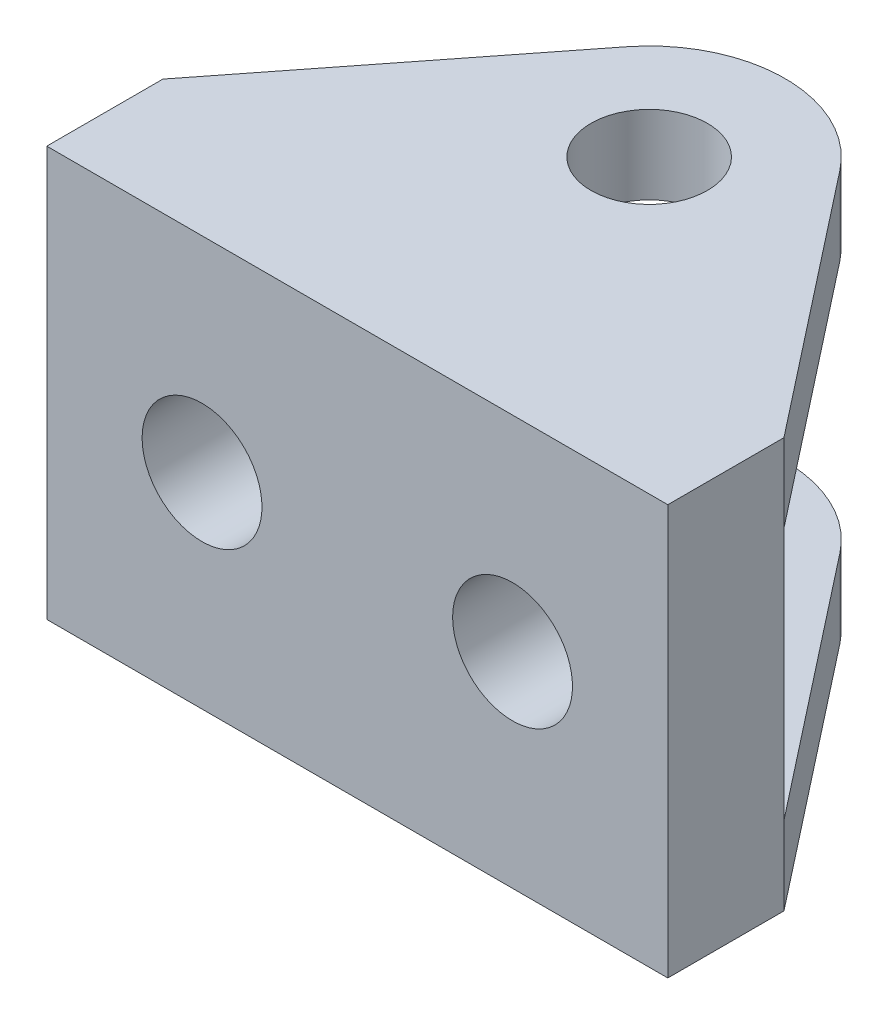
ISO-10303-21;
HEADER;
FILE_DESCRIPTION(('STEP AP214'),'2;1');
FILE_NAME('part.step','',(''),(''),'','','');
FILE_SCHEMA(('AUTOMOTIVE_DESIGN { 1 0 10303 214 1 1 1 1 }'));
ENDSEC;
DATA;
#1=APPLICATION_CONTEXT('core data for automotive mechanical design processes');
#2=APPLICATION_PROTOCOL_DEFINITION('international standard','automotive_design',2000,#1);
#3=PRODUCT_CONTEXT('',#1,'mechanical');
#4=PRODUCT('Part','Part','',(#3));
#5=PRODUCT_RELATED_PRODUCT_CATEGORY('part','',(#4));
#6=PRODUCT_DEFINITION_FORMATION('','',#4);
#7=PRODUCT_DEFINITION_CONTEXT('part definition',#1,'design');
#8=PRODUCT_DEFINITION('design','',#6,#7);
#9=PRODUCT_DEFINITION_SHAPE('','',#8);
#10=(LENGTH_UNIT() NAMED_UNIT(*) SI_UNIT(.MILLI.,.METRE.));
#11=(NAMED_UNIT(*) PLANE_ANGLE_UNIT() SI_UNIT($,.RADIAN.));
#12=(NAMED_UNIT(*) SI_UNIT($,.STERADIAN.) SOLID_ANGLE_UNIT());
#13=UNCERTAINTY_MEASURE_WITH_UNIT(LENGTH_MEASURE(1.E-05),#10,'distance_accuracy_value','');
#14=(GEOMETRIC_REPRESENTATION_CONTEXT(3) GLOBAL_UNCERTAINTY_ASSIGNED_CONTEXT((#13)) GLOBAL_UNIT_ASSIGNED_CONTEXT((#10,
#11,#12)) REPRESENTATION_CONTEXT('',''));
#15=CARTESIAN_POINT('',(0.,0.,0.));
#16=DIRECTION('',(0.,0.,1.));
#17=DIRECTION('',(1.,0.,0.));
#18=AXIS2_PLACEMENT_3D('',#15,#16,#17);
#19=CARTESIAN_POINT('',(50.8,33.528,-9.4996));
#20=DIRECTION('',(-0.78682308880433,0.,0.617178602127791));
#21=DIRECTION('',(0.617178602127791,0.,0.786823088804329));
#22=AXIS2_PLACEMENT_3D('',#19,#20,#21);
#23=PLANE('',#22);
#24=DIRECTION('',(0.,-1.,0.));
#25=VECTOR('',#24,1.);
#26=CARTESIAN_POINT('',(50.8,33.528,-9.4996));
#27=LINE('',#26,#25);
#28=CARTESIAN_POINT('',(50.8,33.528,-9.4996));
#29=VERTEX_POINT('',#28);
#30=CARTESIAN_POINT('',(50.8,27.1145,-9.4996));
#31=VERTEX_POINT('',#30);
#32=EDGE_CURVE('E162',#29,#31,#27,.T.);
#33=ORIENTED_EDGE('',*,*,#32,.T.);
#34=DIRECTION('',(-0.617178602127791,0.,-0.786823088804329));
#35=VECTOR('',#34,1.);
#36=CARTESIAN_POINT('',(50.8,27.1145,-9.4996));
#37=LINE('',#36,#35);
#38=CARTESIAN_POINT('',(34.1435715743381,27.1145,-30.7343972161451));
#39=VERTEX_POINT('',#38);
#40=EDGE_CURVE('E127',#31,#39,#37,.T.);
#41=ORIENTED_EDGE('',*,*,#40,.T.);
#42=DIRECTION('',(0.,-1.,0.));
#43=VECTOR('',#42,1.);
#44=CARTESIAN_POINT('',(34.1435715743381,33.528,-30.7343972161451));
#45=LINE('',#44,#43);
#46=CARTESIAN_POINT('',(34.1435715743381,33.528,-30.7343972161451));
#47=VERTEX_POINT('',#46);
#48=EDGE_CURVE('E125',#47,#39,#45,.T.);
#49=ORIENTED_EDGE('',*,*,#48,.F.);
#50=DIRECTION('',(-0.617178602127791,0.,-0.78682308880433));
#51=VECTOR('',#50,1.);
#52=CARTESIAN_POINT('',(50.8,33.528,-9.4996));
#53=LINE('',#52,#51);
#54=EDGE_CURVE('E110',#29,#47,#53,.T.);
#55=ORIENTED_EDGE('',*,*,#54,.F.);
#56=EDGE_LOOP('',(#33,#41,#49,#55));
#57=FACE_BOUND('',#56,.T.);
#58=ADVANCED_FACE('F39',(#57),#23,.F.);
#59=CARTESIAN_POINT('',(25.4,33.528,-23.876));
#60=DIRECTION('',(0.,-1.,0.));
#61=DIRECTION('',(0.,0.,-1.));
#62=AXIS2_PLACEMENT_3D('',#59,#60,#61);
#63=CYLINDRICAL_SURFACE('',#62,11.1125);
#64=CARTESIAN_POINT('',(25.4,27.1145,-23.876));
#65=DIRECTION('',(0.,1.,0.));
#66=DIRECTION('',(0.,0.,1.));
#67=AXIS2_PLACEMENT_3D('',#64,#65,#66);
#68=CIRCLE('',#67,11.1125);
#69=CARTESIAN_POINT('',(16.6564284256619,27.1145,-30.7343972161451));
#70=VERTEX_POINT('',#69);
#71=EDGE_CURVE('E193',#39,#70,#68,.T.);
#72=ORIENTED_EDGE('',*,*,#71,.T.);
#73=DIRECTION('',(0.,-1.,0.));
#74=VECTOR('',#73,1.);
#75=CARTESIAN_POINT('',(16.6564284256619,33.528,-30.7343972161451));
#76=LINE('',#75,#74);
#77=CARTESIAN_POINT('',(16.6564284256619,33.528,-30.7343972161451));
#78=VERTEX_POINT('',#77);
#79=EDGE_CURVE('E135',#78,#70,#76,.T.);
#80=ORIENTED_EDGE('',*,*,#79,.F.);
#81=CARTESIAN_POINT('',(25.4,33.528,-23.876));
#82=DIRECTION('',(0.,1.,0.));
#83=DIRECTION('',(0.,0.,1.));
#84=AXIS2_PLACEMENT_3D('',#81,#82,#83);
#85=CIRCLE('',#84,11.1125);
#86=EDGE_CURVE('E115',#47,#78,#85,.T.);
#87=ORIENTED_EDGE('',*,*,#86,.F.);
#88=ORIENTED_EDGE('',*,*,#48,.T.);
#89=EDGE_LOOP('',(#72,#80,#87,#88));
#90=FACE_BOUND('',#89,.T.);
#91=ADVANCED_FACE('F133',(#90),#63,.T.);
#92=CARTESIAN_POINT('',(0.,33.528,-9.4996));
#93=DIRECTION('',(0.786823088804329,0.,0.617178602127791));
#94=DIRECTION('',(0.617178602127791,0.,-0.786823088804329));
#95=AXIS2_PLACEMENT_3D('',#92,#93,#94);
#96=PLANE('',#95);
#97=ORIENTED_EDGE('',*,*,#79,.T.);
#98=DIRECTION('',(-0.617178602127791,0.,0.786823088804329));
#99=VECTOR('',#98,1.);
#100=CARTESIAN_POINT('',(0.,27.1145,-9.4996));
#101=LINE('',#100,#99);
#102=CARTESIAN_POINT('',(0.,27.1145,-9.49959999999996));
#103=VERTEX_POINT('',#102);
#104=EDGE_CURVE('E190',#70,#103,#101,.T.);
#105=ORIENTED_EDGE('',*,*,#104,.T.);
#106=DIRECTION('',(0.,-1.,0.));
#107=VECTOR('',#106,1.);
#108=CARTESIAN_POINT('',(0.,33.528,-9.4996));
#109=LINE('',#108,#107);
#110=CARTESIAN_POINT('',(0.,33.528,-9.4996));
#111=VERTEX_POINT('',#110);
#112=EDGE_CURVE('E157',#111,#103,#109,.T.);
#113=ORIENTED_EDGE('',*,*,#112,.F.);
#114=DIRECTION('',(-0.617178602127791,0.,0.786823088804329));
#115=VECTOR('',#114,1.);
#116=CARTESIAN_POINT('',(0.,33.528,-9.4996));
#117=LINE('',#116,#115);
#118=EDGE_CURVE('E65',#78,#111,#117,.T.);
#119=ORIENTED_EDGE('',*,*,#118,.F.);
#120=EDGE_LOOP('',(#97,#105,#113,#119));
#121=FACE_BOUND('',#120,.T.);
#122=ADVANCED_FACE('F226',(#121),#96,.F.);
#123=CARTESIAN_POINT('',(25.4,33.528,-23.876));
#124=DIRECTION('',(0.,-1.,0.));
#125=DIRECTION('',(0.,0.,-1.));
#126=AXIS2_PLACEMENT_3D('',#123,#124,#125);
#127=CYLINDRICAL_SURFACE('',#126,4.7625);
#128=CARTESIAN_POINT('',(25.4,27.1145,-23.876));
#129=DIRECTION('',(0.,1.,0.));
#130=DIRECTION('',(0.,0.,1.));
#131=AXIS2_PLACEMENT_3D('',#128,#129,#130);
#132=CIRCLE('',#131,4.7625);
#133=CARTESIAN_POINT('',(25.4,27.1145,-19.1135));
#134=VERTEX_POINT('',#133);
#135=EDGE_CURVE('E43',#134,#134,#132,.T.);
#136=ORIENTED_EDGE('',*,*,#135,.F.);
#137=EDGE_LOOP('',(#136));
#138=FACE_BOUND('',#137,.T.);
#139=CARTESIAN_POINT('',(25.4,33.528,-23.876));
#140=DIRECTION('',(0.,1.,0.));
#141=DIRECTION('',(0.,0.,1.));
#142=AXIS2_PLACEMENT_3D('',#139,#140,#141);
#143=CIRCLE('',#142,4.7625);
#144=CARTESIAN_POINT('',(25.4,33.528,-19.1135));
#145=VERTEX_POINT('',#144);
#146=EDGE_CURVE('E143',#145,#145,#143,.T.);
#147=ORIENTED_EDGE('',*,*,#146,.T.);
#148=EDGE_LOOP('',(#147));
#149=FACE_BOUND('',#148,.T.);
#150=ADVANCED_FACE('F306',(#138,#149),#127,.F.);
#151=CARTESIAN_POINT('',(25.4,33.528,-23.876));
#152=DIRECTION('',(0.,1.,0.));
#153=DIRECTION('',(0.,0.,1.));
#154=AXIS2_PLACEMENT_3D('',#151,#152,#153);
#155=PLANE('',#154);
#156=DIRECTION('',(0.,0.,1.));
#157=VECTOR('',#156,1.);
#158=CARTESIAN_POINT('',(0.,33.528,0.));
#159=LINE('',#158,#157);
#160=CARTESIAN_POINT('',(0.,33.528,0.));
#161=VERTEX_POINT('',#160);
#162=EDGE_CURVE('E156',#111,#161,#159,.T.);
#163=ORIENTED_EDGE('',*,*,#162,.T.);
#164=DIRECTION('',(1.,0.,0.));
#165=VECTOR('',#164,1.);
#166=CARTESIAN_POINT('',(0.,33.528,0.));
#167=LINE('',#166,#165);
#168=CARTESIAN_POINT('',(50.8,33.528,0.));
#169=VERTEX_POINT('',#168);
#170=EDGE_CURVE('E101',#161,#169,#167,.T.);
#171=ORIENTED_EDGE('',*,*,#170,.T.);
#172=DIRECTION('',(0.,0.,-1.));
#173=VECTOR('',#172,1.);
#174=CARTESIAN_POINT('',(50.8,33.528,0.));
#175=LINE('',#174,#173);
#176=EDGE_CURVE('E118',#169,#29,#175,.T.);
#177=ORIENTED_EDGE('',*,*,#176,.T.);
#178=ORIENTED_EDGE('',*,*,#54,.T.);
#179=ORIENTED_EDGE('',*,*,#86,.T.);
#180=ORIENTED_EDGE('',*,*,#118,.T.);
#181=EDGE_LOOP('',(#163,#171,#177,#178,#179,#180));
#182=FACE_BOUND('',#181,.T.);
#183=ORIENTED_EDGE('',*,*,#146,.F.);
#184=EDGE_LOOP('',(#183));
#185=FACE_BOUND('',#184,.T.);
#186=ADVANCED_FACE('F112',(#182,#185),#155,.T.);
#187=CARTESIAN_POINT('',(25.4,0.,-23.876));
#188=DIRECTION('',(0.,1.,0.));
#189=DIRECTION('',(0.,0.,1.));
#190=AXIS2_PLACEMENT_3D('',#187,#188,#189);
#191=PLANE('',#190);
#192=DIRECTION('',(0.,0.,1.));
#193=VECTOR('',#192,1.);
#194=CARTESIAN_POINT('',(0.,0.,0.));
#195=LINE('',#194,#193);
#196=CARTESIAN_POINT('',(0.,0.,-9.4996));
#197=VERTEX_POINT('',#196);
#198=CARTESIAN_POINT('',(0.,0.,0.));
#199=VERTEX_POINT('',#198);
#200=EDGE_CURVE('E140',#197,#199,#195,.T.);
#201=ORIENTED_EDGE('',*,*,#200,.F.);
#202=DIRECTION('',(-0.617178602127791,0.,0.786823088804329));
#203=VECTOR('',#202,1.);
#204=CARTESIAN_POINT('',(0.,0.,-9.4996));
#205=LINE('',#204,#203);
#206=CARTESIAN_POINT('',(16.6564284256619,0.,-30.7343972161451));
#207=VERTEX_POINT('',#206);
#208=EDGE_CURVE('E154',#207,#197,#205,.T.);
#209=ORIENTED_EDGE('',*,*,#208,.F.);
#210=CARTESIAN_POINT('',(25.4,0.,-23.876));
#211=DIRECTION('',(0.,1.,0.));
#212=DIRECTION('',(0.,0.,1.));
#213=AXIS2_PLACEMENT_3D('',#210,#211,#212);
#214=CIRCLE('',#213,11.1125);
#215=CARTESIAN_POINT('',(34.1435715743381,0.,-30.7343972161451));
#216=VERTEX_POINT('',#215);
#217=EDGE_CURVE('E151',#216,#207,#214,.T.);
#218=ORIENTED_EDGE('',*,*,#217,.F.);
#219=DIRECTION('',(-0.617178602127791,0.,-0.78682308880433));
#220=VECTOR('',#219,1.);
#221=CARTESIAN_POINT('',(50.8,0.,-9.4996));
#222=LINE('',#221,#220);
#223=CARTESIAN_POINT('',(50.8,0.,-9.4996));
#224=VERTEX_POINT('',#223);
#225=EDGE_CURVE('E148',#224,#216,#222,.T.);
#226=ORIENTED_EDGE('',*,*,#225,.F.);
#227=DIRECTION('',(0.,0.,-1.));
#228=VECTOR('',#227,1.);
#229=CARTESIAN_POINT('',(50.8,0.,0.));
#230=LINE('',#229,#228);
#231=CARTESIAN_POINT('',(50.8,0.,0.));
#232=VERTEX_POINT('',#231);
#233=EDGE_CURVE('E145',#232,#224,#230,.T.);
#234=ORIENTED_EDGE('',*,*,#233,.F.);
#235=DIRECTION('',(1.,0.,0.));
#236=VECTOR('',#235,1.);
#237=CARTESIAN_POINT('',(0.,0.,0.));
#238=LINE('',#237,#236);
#239=EDGE_CURVE('E142',#199,#232,#238,.T.);
#240=ORIENTED_EDGE('',*,*,#239,.F.);
#241=EDGE_LOOP('',(#201,#209,#218,#226,#234,#240));
#242=FACE_BOUND('',#241,.T.);
#243=CARTESIAN_POINT('',(25.4,0.,-23.876));
#244=DIRECTION('',(0.,1.,0.));
#245=DIRECTION('',(0.,0.,1.));
#246=AXIS2_PLACEMENT_3D('',#243,#244,#245);
#247=CIRCLE('',#246,4.7625);
#248=CARTESIAN_POINT('',(25.4,0.,-19.1135));
#249=VERTEX_POINT('',#248);
#250=EDGE_CURVE('E196',#249,#249,#247,.T.);
#251=ORIENTED_EDGE('',*,*,#250,.T.);
#252=EDGE_LOOP('',(#251));
#253=FACE_BOUND('',#252,.T.);
#254=ADVANCED_FACE('F230',(#242,#253),#191,.F.);
#255=CARTESIAN_POINT('',(0.,33.528,0.));
#256=DIRECTION('',(1.,0.,0.));
#257=DIRECTION('',(0.,0.,-1.));
#258=AXIS2_PLACEMENT_3D('',#255,#256,#257);
#259=PLANE('',#258);
#260=ORIENTED_EDGE('',*,*,#200,.T.);
#261=DIRECTION('',(0.,-1.,0.));
#262=VECTOR('',#261,1.);
#263=CARTESIAN_POINT('',(0.,33.528,0.));
#264=LINE('',#263,#262);
#265=EDGE_CURVE('E11',#161,#199,#264,.T.);
#266=ORIENTED_EDGE('',*,*,#265,.F.);
#267=ORIENTED_EDGE('',*,*,#162,.F.);
#268=ORIENTED_EDGE('',*,*,#112,.T.);
#269=DIRECTION('',(0.,-1.,0.));
#270=VECTOR('',#269,1.);
#271=CARTESIAN_POINT('',(0.,16.764,-9.49959999999997));
#272=LINE('',#271,#270);
#273=CARTESIAN_POINT('',(0.,6.4135,-9.4996));
#274=VERTEX_POINT('',#273);
#275=EDGE_CURVE('E179',#103,#274,#272,.T.);
#276=ORIENTED_EDGE('',*,*,#275,.T.);
#277=EDGE_CURVE('E93',#274,#197,#109,.T.);
#278=ORIENTED_EDGE('',*,*,#277,.T.);
#279=EDGE_LOOP('',(#260,#266,#267,#268,#276,#278));
#280=FACE_BOUND('',#279,.T.);
#281=ADVANCED_FACE('F41',(#280),#259,.F.);
#282=CARTESIAN_POINT('',(0.,33.528,0.));
#283=DIRECTION('',(0.,0.,-1.));
#284=DIRECTION('',(-1.,0.,0.));
#285=AXIS2_PLACEMENT_3D('',#282,#283,#284);
#286=PLANE('',#285);
#287=CARTESIAN_POINT('',(38.1,16.764,0.));
#288=DIRECTION('',(0.,0.,-1.));
#289=DIRECTION('',(-1.,0.,0.));
#290=AXIS2_PLACEMENT_3D('',#287,#288,#289);
#291=CIRCLE('',#290,4.9022);
#292=CARTESIAN_POINT('',(33.1978,16.764,0.));
#293=VERTEX_POINT('',#292);
#294=EDGE_CURVE('E244',#293,#293,#291,.F.);
#295=ORIENTED_EDGE('',*,*,#294,.F.);
#296=EDGE_LOOP('',(#295));
#297=FACE_BOUND('',#296,.T.);
#298=CARTESIAN_POINT('',(12.7,16.764,0.));
#299=DIRECTION('',(0.,0.,-1.));
#300=DIRECTION('',(-1.,0.,0.));
#301=AXIS2_PLACEMENT_3D('',#298,#299,#300);
#302=CIRCLE('',#301,4.9022);
#303=CARTESIAN_POINT('',(7.7978,16.764,0.));
#304=VERTEX_POINT('',#303);
#305=EDGE_CURVE('E250',#304,#304,#302,.F.);
#306=ORIENTED_EDGE('',*,*,#305,.F.);
#307=EDGE_LOOP('',(#306));
#308=FACE_BOUND('',#307,.T.);
#309=ORIENTED_EDGE('',*,*,#239,.T.);
#310=DIRECTION('',(0.,-1.,0.));
#311=VECTOR('',#310,1.);
#312=CARTESIAN_POINT('',(50.8,33.528,0.));
#313=LINE('',#312,#311);
#314=EDGE_CURVE('E48',#169,#232,#313,.T.);
#315=ORIENTED_EDGE('',*,*,#314,.F.);
#316=ORIENTED_EDGE('',*,*,#170,.F.);
#317=ORIENTED_EDGE('',*,*,#265,.T.);
#318=EDGE_LOOP('',(#309,#315,#316,#317));
#319=FACE_BOUND('',#318,.T.);
#320=ADVANCED_FACE('F204',(#297,#308,#319),#286,.F.);
#321=CARTESIAN_POINT('',(50.8,33.528,0.));
#322=DIRECTION('',(-1.,0.,0.));
#323=DIRECTION('',(0.,0.,1.));
#324=AXIS2_PLACEMENT_3D('',#321,#322,#323);
#325=PLANE('',#324);
#326=ORIENTED_EDGE('',*,*,#233,.T.);
#327=CARTESIAN_POINT('',(50.8,6.4135,-9.4996));
#328=VERTEX_POINT('',#327);
#329=EDGE_CURVE('E130',#328,#224,#27,.T.);
#330=ORIENTED_EDGE('',*,*,#329,.F.);
#331=DIRECTION('',(0.,-1.,0.));
#332=VECTOR('',#331,1.);
#333=CARTESIAN_POINT('',(50.8,16.764,-9.4996));
#334=LINE('',#333,#332);
#335=EDGE_CURVE('E182',#31,#328,#334,.T.);
#336=ORIENTED_EDGE('',*,*,#335,.F.);
#337=ORIENTED_EDGE('',*,*,#32,.F.);
#338=ORIENTED_EDGE('',*,*,#176,.F.);
#339=ORIENTED_EDGE('',*,*,#314,.T.);
#340=EDGE_LOOP('',(#326,#330,#336,#337,#338,#339));
#341=FACE_BOUND('',#340,.T.);
#342=ADVANCED_FACE('F207',(#341),#325,.F.);
#343=CARTESIAN_POINT('',(34.1435715743381,6.4135,-30.7343972161451));
#344=VERTEX_POINT('',#343);
#345=EDGE_CURVE('E131',#344,#216,#45,.T.);
#346=ORIENTED_EDGE('',*,*,#345,.F.);
#347=DIRECTION('',(0.617178602127791,0.,0.786823088804329));
#348=VECTOR('',#347,1.);
#349=CARTESIAN_POINT('',(50.8,6.4135,-9.4996));
#350=LINE('',#349,#348);
#351=EDGE_CURVE('E187',#344,#328,#350,.T.);
#352=ORIENTED_EDGE('',*,*,#351,.T.);
#353=ORIENTED_EDGE('',*,*,#329,.T.);
#354=ORIENTED_EDGE('',*,*,#225,.T.);
#355=EDGE_LOOP('',(#346,#352,#353,#354));
#356=FACE_BOUND('',#355,.T.);
#357=ADVANCED_FACE('F236',(#356),#23,.F.);
#358=CARTESIAN_POINT('',(16.6564284256619,6.4135,-30.7343972161451));
#359=VERTEX_POINT('',#358);
#360=EDGE_CURVE('E160',#359,#207,#76,.T.);
#361=ORIENTED_EDGE('',*,*,#360,.F.);
#362=CARTESIAN_POINT('',(25.4,6.4135,-23.876));
#363=DIRECTION('',(0.,-1.,0.));
#364=DIRECTION('',(0.,0.,-1.));
#365=AXIS2_PLACEMENT_3D('',#362,#363,#364);
#366=CIRCLE('',#365,11.1125);
#367=EDGE_CURVE('E172',#359,#344,#366,.T.);
#368=ORIENTED_EDGE('',*,*,#367,.T.);
#369=ORIENTED_EDGE('',*,*,#345,.T.);
#370=ORIENTED_EDGE('',*,*,#217,.T.);
#371=EDGE_LOOP('',(#361,#368,#369,#370));
#372=FACE_BOUND('',#371,.T.);
#373=ADVANCED_FACE('F241',(#372),#63,.T.);
#374=ORIENTED_EDGE('',*,*,#277,.F.);
#375=DIRECTION('',(0.617178602127791,0.,-0.786823088804329));
#376=VECTOR('',#375,1.);
#377=CARTESIAN_POINT('',(0.,6.4135,-9.4996));
#378=LINE('',#377,#376);
#379=EDGE_CURVE('E167',#274,#359,#378,.T.);
#380=ORIENTED_EDGE('',*,*,#379,.T.);
#381=ORIENTED_EDGE('',*,*,#360,.T.);
#382=ORIENTED_EDGE('',*,*,#208,.T.);
#383=EDGE_LOOP('',(#374,#380,#381,#382));
#384=FACE_BOUND('',#383,.T.);
#385=ADVANCED_FACE('F243',(#384),#96,.F.);
#386=CARTESIAN_POINT('',(25.4,6.4135,-23.876));
#387=DIRECTION('',(0.,-1.,0.));
#388=DIRECTION('',(0.,0.,-1.));
#389=AXIS2_PLACEMENT_3D('',#386,#387,#388);
#390=CIRCLE('',#389,4.7625);
#391=CARTESIAN_POINT('',(25.4,6.4135,-28.6385));
#392=VERTEX_POINT('',#391);
#393=EDGE_CURVE('E165',#392,#392,#390,.T.);
#394=ORIENTED_EDGE('',*,*,#393,.F.);
#395=EDGE_LOOP('',(#394));
#396=FACE_BOUND('',#395,.T.);
#397=ORIENTED_EDGE('',*,*,#250,.F.);
#398=EDGE_LOOP('',(#397));
#399=FACE_BOUND('',#398,.T.);
#400=ADVANCED_FACE('F311',(#396,#399),#127,.F.);
#401=CARTESIAN_POINT('',(0.,27.1145,-9.49959999999996));
#402=DIRECTION('',(0.,1.,0.));
#403=DIRECTION('',(0.,0.,1.));
#404=AXIS2_PLACEMENT_3D('',#401,#402,#403);
#405=PLANE('',#404);
#406=ORIENTED_EDGE('',*,*,#135,.T.);
#407=EDGE_LOOP('',(#406));
#408=FACE_BOUND('',#407,.T.);
#409=DIRECTION('',(1.,0.,0.));
#410=VECTOR('',#409,1.);
#411=CARTESIAN_POINT('',(0.,27.1145,-9.49959999999996));
#412=LINE('',#411,#410);
#413=EDGE_CURVE('E168',#103,#31,#412,.T.);
#414=ORIENTED_EDGE('',*,*,#413,.F.);
#415=ORIENTED_EDGE('',*,*,#104,.F.);
#416=ORIENTED_EDGE('',*,*,#71,.F.);
#417=ORIENTED_EDGE('',*,*,#40,.F.);
#418=EDGE_LOOP('',(#414,#415,#416,#417));
#419=FACE_BOUND('',#418,.T.);
#420=ADVANCED_FACE('F224',(#408,#419),#405,.F.);
#421=CARTESIAN_POINT('',(0.,6.4135,-9.49959999999996));
#422=DIRECTION('',(0.,-1.,0.));
#423=DIRECTION('',(0.,0.,-1.));
#424=AXIS2_PLACEMENT_3D('',#421,#422,#423);
#425=PLANE('',#424);
#426=ORIENTED_EDGE('',*,*,#393,.T.);
#427=EDGE_LOOP('',(#426));
#428=FACE_BOUND('',#427,.T.);
#429=ORIENTED_EDGE('',*,*,#367,.F.);
#430=ORIENTED_EDGE('',*,*,#379,.F.);
#431=DIRECTION('',(1.,0.,0.));
#432=VECTOR('',#431,1.);
#433=CARTESIAN_POINT('',(0.,6.4135,-9.49959999999996));
#434=LINE('',#433,#432);
#435=EDGE_CURVE('E56',#274,#328,#434,.T.);
#436=ORIENTED_EDGE('',*,*,#435,.T.);
#437=ORIENTED_EDGE('',*,*,#351,.F.);
#438=EDGE_LOOP('',(#429,#430,#436,#437));
#439=FACE_BOUND('',#438,.T.);
#440=ADVANCED_FACE('F238',(#428,#439),#425,.F.);
#441=CARTESIAN_POINT('',(0.,16.764,-9.49959999999997));
#442=DIRECTION('',(0.,0.,1.));
#443=DIRECTION('',(1.,0.,0.));
#444=AXIS2_PLACEMENT_3D('',#441,#442,#443);
#445=PLANE('',#444);
#446=CARTESIAN_POINT('',(38.1,16.764,-9.49959999999999));
#447=DIRECTION('',(0.,0.,-1.));
#448=DIRECTION('',(-1.,0.,0.));
#449=AXIS2_PLACEMENT_3D('',#446,#447,#448);
#450=CIRCLE('',#449,4.9022);
#451=CARTESIAN_POINT('',(33.1978,16.764,-9.49959999999999));
#452=VERTEX_POINT('',#451);
#453=EDGE_CURVE('E249',#452,#452,#450,.T.);
#454=ORIENTED_EDGE('',*,*,#453,.F.);
#455=EDGE_LOOP('',(#454));
#456=FACE_BOUND('',#455,.T.);
#457=CARTESIAN_POINT('',(12.7,16.764,-9.49959999999997));
#458=DIRECTION('',(0.,0.,-1.));
#459=DIRECTION('',(-1.,0.,0.));
#460=AXIS2_PLACEMENT_3D('',#457,#458,#459);
#461=CIRCLE('',#460,4.9022);
#462=CARTESIAN_POINT('',(7.7978,16.764,-9.49959999999997));
#463=VERTEX_POINT('',#462);
#464=EDGE_CURVE('E246',#463,#463,#461,.T.);
#465=ORIENTED_EDGE('',*,*,#464,.F.);
#466=EDGE_LOOP('',(#465));
#467=FACE_BOUND('',#466,.T.);
#468=ORIENTED_EDGE('',*,*,#335,.T.);
#469=ORIENTED_EDGE('',*,*,#435,.F.);
#470=ORIENTED_EDGE('',*,*,#275,.F.);
#471=ORIENTED_EDGE('',*,*,#413,.T.);
#472=EDGE_LOOP('',(#468,#469,#470,#471));
#473=FACE_BOUND('',#472,.T.);
#474=ADVANCED_FACE('F260',(#456,#467,#473),#445,.F.);
#475=CARTESIAN_POINT('',(12.7,16.764,13.8655154509308));
#476=DIRECTION('',(0.,0.,-1.));
#477=DIRECTION('',(-1.,0.,0.));
#478=AXIS2_PLACEMENT_3D('',#475,#476,#477);
#479=CYLINDRICAL_SURFACE('',#478,4.9022);
#480=ORIENTED_EDGE('',*,*,#305,.T.);
#481=EDGE_LOOP('',(#480));
#482=FACE_BOUND('',#481,.T.);
#483=ORIENTED_EDGE('',*,*,#464,.T.);
#484=EDGE_LOOP('',(#483));
#485=FACE_BOUND('',#484,.T.);
#486=ADVANCED_FACE('F263',(#482,#485),#479,.F.);
#487=CARTESIAN_POINT('',(38.1,16.764,13.8655154509308));
#488=DIRECTION('',(0.,0.,-1.));
#489=DIRECTION('',(-1.,0.,0.));
#490=AXIS2_PLACEMENT_3D('',#487,#488,#489);
#491=CYLINDRICAL_SURFACE('',#490,4.9022);
#492=ORIENTED_EDGE('',*,*,#294,.T.);
#493=EDGE_LOOP('',(#492));
#494=FACE_BOUND('',#493,.T.);
#495=ORIENTED_EDGE('',*,*,#453,.T.);
#496=EDGE_LOOP('',(#495));
#497=FACE_BOUND('',#496,.T.);
#498=ADVANCED_FACE('F258',(#494,#497),#491,.F.);
#499=CLOSED_SHELL('',(#58,#91,#122,#150,#186,#254,#281,#320,#342,#357,#373,#385,#400,#420,#440,
#474,#486,#498));
#500=MANIFOLD_SOLID_BREP('B2',#499);
#501=ADVANCED_BREP_SHAPE_REPRESENTATION('',(#18,#500),#14);
#502=SHAPE_DEFINITION_REPRESENTATION(#9,#501);
ENDSEC;
END-ISO-10303-21;
